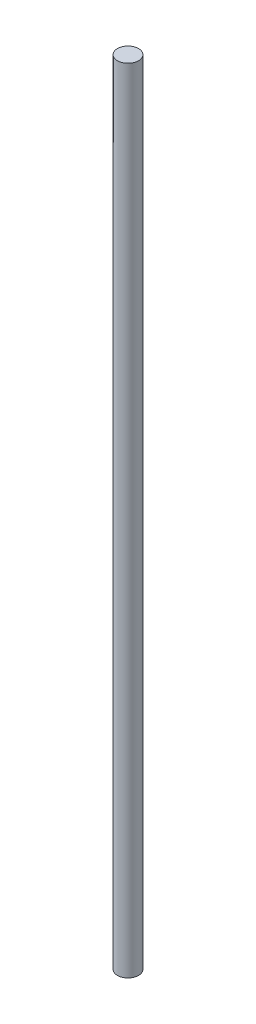
ISO-10303-21;
HEADER;
FILE_DESCRIPTION(('STEP AP214'),'2;1');
FILE_NAME('part.step','',(''),(''),'','','');
FILE_SCHEMA(('AUTOMOTIVE_DESIGN { 1 0 10303 214 1 1 1 1 }'));
ENDSEC;
DATA;
#1=APPLICATION_CONTEXT('core data for automotive mechanical design processes');
#2=APPLICATION_PROTOCOL_DEFINITION('international standard','automotive_design',2000,#1);
#3=PRODUCT_CONTEXT('',#1,'mechanical');
#4=PRODUCT('Part','Part','',(#3));
#5=PRODUCT_RELATED_PRODUCT_CATEGORY('part','',(#4));
#6=PRODUCT_DEFINITION_FORMATION('','',#4);
#7=PRODUCT_DEFINITION_CONTEXT('part definition',#1,'design');
#8=PRODUCT_DEFINITION('design','',#6,#7);
#9=PRODUCT_DEFINITION_SHAPE('','',#8);
#10=(LENGTH_UNIT() NAMED_UNIT(*) SI_UNIT(.MILLI.,.METRE.));
#11=(NAMED_UNIT(*) PLANE_ANGLE_UNIT() SI_UNIT($,.RADIAN.));
#12=(NAMED_UNIT(*) SI_UNIT($,.STERADIAN.) SOLID_ANGLE_UNIT());
#13=UNCERTAINTY_MEASURE_WITH_UNIT(LENGTH_MEASURE(1.E-05),#10,'distance_accuracy_value','');
#14=(GEOMETRIC_REPRESENTATION_CONTEXT(3) GLOBAL_UNCERTAINTY_ASSIGNED_CONTEXT((#13)) GLOBAL_UNIT_ASSIGNED_CONTEXT((#10,
#11,#12)) REPRESENTATION_CONTEXT('',''));
#15=CARTESIAN_POINT('',(0.,0.,0.));
#16=DIRECTION('',(0.,0.,1.));
#17=DIRECTION('',(1.,0.,0.));
#18=AXIS2_PLACEMENT_3D('',#15,#16,#17);
#19=CARTESIAN_POINT('',(0.,375.,0.));
#20=DIRECTION('',(0.,-1.,0.));
#21=DIRECTION('',(0.,0.,-1.));
#22=AXIS2_PLACEMENT_3D('',#19,#20,#21);
#23=CYLINDRICAL_SURFACE('',#22,10.);
#24=CARTESIAN_POINT('',(0.,375.,0.));
#25=DIRECTION('',(0.,1.,0.));
#26=DIRECTION('',(0.,0.,1.));
#27=AXIS2_PLACEMENT_3D('',#24,#25,#26);
#28=CIRCLE('',#27,10.);
#29=CARTESIAN_POINT('',(0.,375.,10.));
#30=VERTEX_POINT('',#29);
#31=EDGE_CURVE('E10',#30,#30,#28,.T.);
#32=ORIENTED_EDGE('',*,*,#31,.F.);
#33=EDGE_LOOP('',(#32));
#34=FACE_BOUND('',#33,.T.);
#35=CARTESIAN_POINT('',(0.,-375.,0.));
#36=DIRECTION('',(0.,1.,0.));
#37=DIRECTION('',(0.,0.,1.));
#38=AXIS2_PLACEMENT_3D('',#35,#36,#37);
#39=CIRCLE('',#38,10.);
#40=CARTESIAN_POINT('',(0.,-375.,10.));
#41=VERTEX_POINT('',#40);
#42=EDGE_CURVE('E38',#41,#41,#39,.T.);
#43=ORIENTED_EDGE('',*,*,#42,.T.);
#44=EDGE_LOOP('',(#43));
#45=FACE_BOUND('',#44,.T.);
#46=ADVANCED_FACE('F35',(#34,#45),#23,.T.);
#47=CARTESIAN_POINT('',(0.,375.,0.));
#48=DIRECTION('',(0.,1.,0.));
#49=DIRECTION('',(0.,0.,1.));
#50=AXIS2_PLACEMENT_3D('',#47,#48,#49);
#51=PLANE('',#50);
#52=ORIENTED_EDGE('',*,*,#31,.T.);
#53=EDGE_LOOP('',(#52));
#54=FACE_BOUND('',#53,.T.);
#55=ADVANCED_FACE('F50',(#54),#51,.T.);
#56=CARTESIAN_POINT('',(0.,-375.,0.));
#57=DIRECTION('',(0.,1.,0.));
#58=DIRECTION('',(0.,0.,1.));
#59=AXIS2_PLACEMENT_3D('',#56,#57,#58);
#60=PLANE('',#59);
#61=ORIENTED_EDGE('',*,*,#42,.F.);
#62=EDGE_LOOP('',(#61));
#63=FACE_BOUND('',#62,.T.);
#64=ADVANCED_FACE('F48',(#63),#60,.F.);
#65=CLOSED_SHELL('',(#46,#55,#64));
#66=MANIFOLD_SOLID_BREP('B2',#65);
#67=ADVANCED_BREP_SHAPE_REPRESENTATION('',(#18,#66),#14);
#68=SHAPE_DEFINITION_REPRESENTATION(#9,#67);
ENDSEC;
END-ISO-10303-21;
